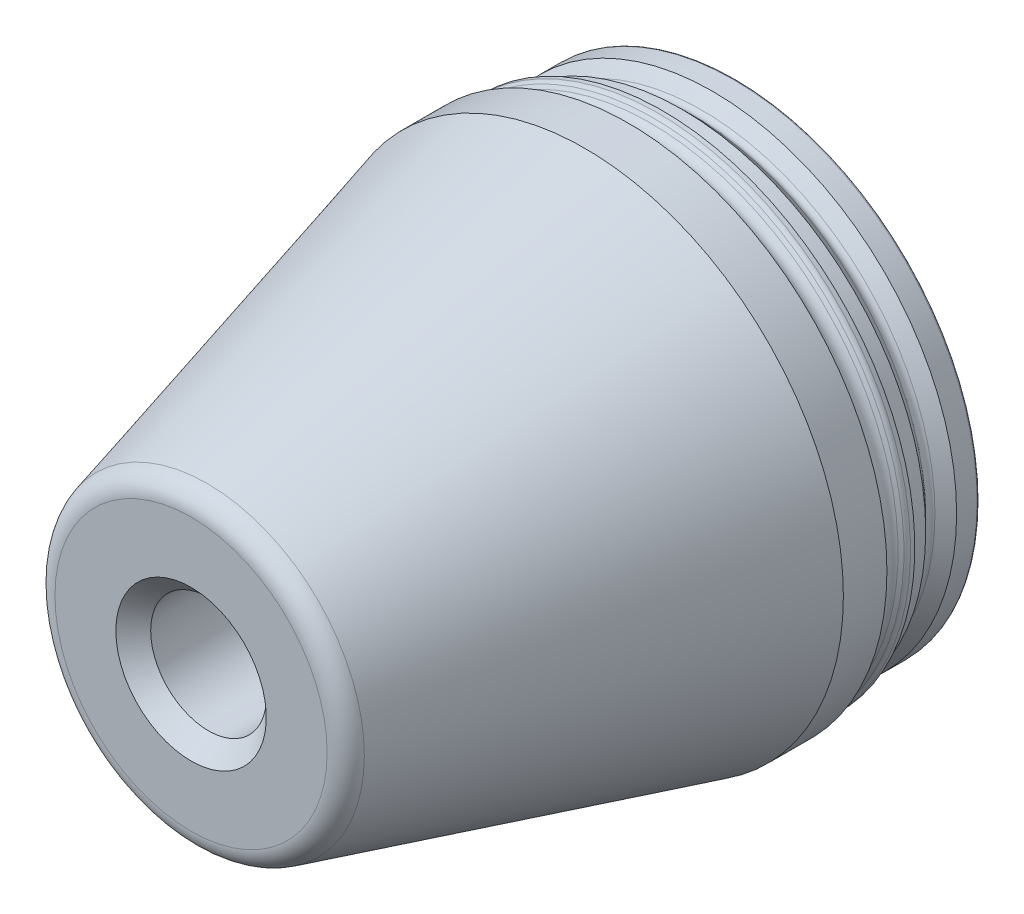
ISO-10303-21;
HEADER;
FILE_DESCRIPTION(('STEP AP214'),'2;1');
FILE_NAME('part.step','',(''),(''),'','','');
FILE_SCHEMA(('AUTOMOTIVE_DESIGN { 1 0 10303 214 1 1 1 1 }'));
ENDSEC;
DATA;
#1=APPLICATION_CONTEXT('core data for automotive mechanical design processes');
#2=APPLICATION_PROTOCOL_DEFINITION('international standard','automotive_design',2000,#1);
#3=PRODUCT_CONTEXT('',#1,'mechanical');
#4=PRODUCT('Part','Part','',(#3));
#5=PRODUCT_RELATED_PRODUCT_CATEGORY('part','',(#4));
#6=PRODUCT_DEFINITION_FORMATION('','',#4);
#7=PRODUCT_DEFINITION_CONTEXT('part definition',#1,'design');
#8=PRODUCT_DEFINITION('design','',#6,#7);
#9=PRODUCT_DEFINITION_SHAPE('','',#8);
#10=(LENGTH_UNIT() NAMED_UNIT(*) SI_UNIT(.MILLI.,.METRE.));
#11=(NAMED_UNIT(*) PLANE_ANGLE_UNIT() SI_UNIT($,.RADIAN.));
#12=(NAMED_UNIT(*) SI_UNIT($,.STERADIAN.) SOLID_ANGLE_UNIT());
#13=UNCERTAINTY_MEASURE_WITH_UNIT(LENGTH_MEASURE(1.E-05),#10,'distance_accuracy_value','');
#14=(GEOMETRIC_REPRESENTATION_CONTEXT(3) GLOBAL_UNCERTAINTY_ASSIGNED_CONTEXT((#13)) GLOBAL_UNIT_ASSIGNED_CONTEXT((#10,
#11,#12)) REPRESENTATION_CONTEXT('',''));
#15=CARTESIAN_POINT('',(0.,0.,0.));
#16=DIRECTION('',(0.,0.,1.));
#17=DIRECTION('',(1.,0.,0.));
#18=AXIS2_PLACEMENT_3D('',#15,#16,#17);
#19=CARTESIAN_POINT('',(0.,0.,47.5723097288361));
#20=DIRECTION('',(0.,0.,-1.));
#21=DIRECTION('',(-1.,0.,0.));
#22=AXIS2_PLACEMENT_3D('',#19,#20,#21);
#23=CYLINDRICAL_SURFACE('',#22,30.1625);
#24=CARTESIAN_POINT('',(0.,0.,9.0577621749045));
#25=DIRECTION('',(0.,0.,-1.));
#26=DIRECTION('',(-1.,0.,0.));
#27=AXIS2_PLACEMENT_3D('',#24,#25,#26);
#28=CIRCLE('',#27,30.1625);
#29=CARTESIAN_POINT('',(-30.1625,0.,9.0577621749045));
#30=VERTEX_POINT('',#29);
#31=EDGE_CURVE('E10',#30,#30,#28,.T.);
#32=ORIENTED_EDGE('',*,*,#31,.T.);
#33=EDGE_LOOP('',(#32));
#34=FACE_BOUND('',#33,.T.);
#35=CARTESIAN_POINT('',(0.,0.,3.9777621749045));
#36=DIRECTION('',(0.,0.,-1.));
#37=DIRECTION('',(-1.,0.,0.));
#38=AXIS2_PLACEMENT_3D('',#35,#36,#37);
#39=CIRCLE('',#38,30.1625);
#40=CARTESIAN_POINT('',(-30.1625,0.,3.9777621749045));
#41=VERTEX_POINT('',#40);
#42=EDGE_CURVE('E108',#41,#41,#39,.T.);
#43=ORIENTED_EDGE('',*,*,#42,.F.);
#44=EDGE_LOOP('',(#43));
#45=FACE_BOUND('',#44,.T.);
#46=ADVANCED_FACE('F38',(#34,#45),#23,.T.);
#47=CARTESIAN_POINT('',(0.,0.,9.0577621749045));
#48=DIRECTION('',(0.,0.,-1.));
#49=DIRECTION('',(-1.,0.,0.));
#50=AXIS2_PLACEMENT_3D('',#47,#48,#49);
#51=CONICAL_SURFACE('',#50,30.1625,0.262449830260544);
#52=CARTESIAN_POINT('',(0.,0.,53.1099960644797));
#53=DIRECTION('',(0.,0.,-1.));
#54=DIRECTION('',(-1.,0.,0.));
#55=AXIS2_PLACEMENT_3D('',#52,#53,#54);
#56=CIRCLE('',#55,18.3280234786891);
#57=CARTESIAN_POINT('',(-18.3280234786891,0.,53.1099960644797));
#58=VERTEX_POINT('',#57);
#59=EDGE_CURVE('E44',#58,#58,#56,.T.);
#60=ORIENTED_EDGE('',*,*,#59,.T.);
#61=EDGE_LOOP('',(#60));
#62=FACE_BOUND('',#61,.T.);
#63=ORIENTED_EDGE('',*,*,#31,.F.);
#64=EDGE_LOOP('',(#63));
#65=FACE_BOUND('',#64,.T.);
#66=ADVANCED_FACE('F116',(#62,#65),#51,.T.);
#67=CARTESIAN_POINT('',(0.,0.,52.451));
#68=DIRECTION('',(0.,0.,-1.));
#69=DIRECTION('',(-1.,0.,0.));
#70=AXIS2_PLACEMENT_3D('',#67,#68,#69);
#71=TOROIDAL_SURFACE('',#70,15.875,2.53999999999999);
#72=CARTESIAN_POINT('',(0.,0.,54.991));
#73=DIRECTION('',(0.,0.,-1.));
#74=DIRECTION('',(-1.,0.,0.));
#75=AXIS2_PLACEMENT_3D('',#72,#73,#74);
#76=CIRCLE('',#75,15.875);
#77=CARTESIAN_POINT('',(-15.875,0.,54.991));
#78=VERTEX_POINT('',#77);
#79=EDGE_CURVE('E48',#78,#78,#76,.T.);
#80=ORIENTED_EDGE('',*,*,#79,.T.);
#81=EDGE_LOOP('',(#80));
#82=FACE_BOUND('',#81,.T.);
#83=ORIENTED_EDGE('',*,*,#59,.F.);
#84=EDGE_LOOP('',(#83));
#85=FACE_BOUND('',#84,.T.);
#86=ADVANCED_FACE('F120',(#82,#85),#71,.T.);
#87=CARTESIAN_POINT('',(0.,15.875,54.991));
#88=DIRECTION('',(0.,0.,1.));
#89=DIRECTION('',(1.,0.,0.));
#90=AXIS2_PLACEMENT_3D('',#87,#88,#89);
#91=PLANE('',#90);
#92=CARTESIAN_POINT('',(0.,0.,54.991));
#93=DIRECTION('',(0.,0.,-1.));
#94=DIRECTION('',(-1.,0.,0.));
#95=AXIS2_PLACEMENT_3D('',#92,#93,#94);
#96=CIRCLE('',#95,8.77569999999999);
#97=CARTESIAN_POINT('',(-8.77569999999999,0.,54.991));
#98=VERTEX_POINT('',#97);
#99=EDGE_CURVE('E52',#98,#98,#96,.T.);
#100=ORIENTED_EDGE('',*,*,#99,.T.);
#101=EDGE_LOOP('',(#100));
#102=FACE_BOUND('',#101,.T.);
#103=ORIENTED_EDGE('',*,*,#79,.F.);
#104=EDGE_LOOP('',(#103));
#105=FACE_BOUND('',#104,.T.);
#106=ADVANCED_FACE('F124',(#102,#105),#91,.T.);
#107=CARTESIAN_POINT('',(0.,0.,54.991));
#108=DIRECTION('',(0.,0.,1.));
#109=DIRECTION('',(1.,0.,0.));
#110=AXIS2_PLACEMENT_3D('',#107,#108,#109);
#111=CONICAL_SURFACE('',#110,8.77569999999999,0.785398163397447);
#112=CARTESIAN_POINT('',(0.,0.,52.959));
#113=DIRECTION('',(0.,0.,-1.));
#114=DIRECTION('',(-1.,0.,0.));
#115=AXIS2_PLACEMENT_3D('',#112,#113,#114);
#116=CIRCLE('',#115,6.74369999999999);
#117=CARTESIAN_POINT('',(-6.74369999999999,0.,52.959));
#118=VERTEX_POINT('',#117);
#119=EDGE_CURVE('E57',#118,#118,#116,.T.);
#120=ORIENTED_EDGE('',*,*,#119,.T.);
#121=EDGE_LOOP('',(#120));
#122=FACE_BOUND('',#121,.T.);
#123=ORIENTED_EDGE('',*,*,#99,.F.);
#124=EDGE_LOOP('',(#123));
#125=FACE_BOUND('',#124,.T.);
#126=ADVANCED_FACE('F131',(#122,#125),#111,.F.);
#127=CARTESIAN_POINT('',(0.,0.,47.5723097288361));
#128=DIRECTION('',(0.,0.,-1.));
#129=DIRECTION('',(-1.,0.,0.));
#130=AXIS2_PLACEMENT_3D('',#127,#128,#129);
#131=CYLINDRICAL_SURFACE('',#130,6.7437);
#132=CARTESIAN_POINT('',(0.,0.,11.9395711757683));
#133=DIRECTION('',(0.,0.,-1.));
#134=DIRECTION('',(-1.,0.,0.));
#135=AXIS2_PLACEMENT_3D('',#132,#133,#134);
#136=CIRCLE('',#135,6.7437);
#137=CARTESIAN_POINT('',(-6.7437,0.,11.9395711757683));
#138=VERTEX_POINT('',#137);
#139=EDGE_CURVE('E60',#138,#138,#136,.T.);
#140=ORIENTED_EDGE('',*,*,#139,.T.);
#141=EDGE_LOOP('',(#140));
#142=FACE_BOUND('',#141,.T.);
#143=ORIENTED_EDGE('',*,*,#119,.F.);
#144=EDGE_LOOP('',(#143));
#145=FACE_BOUND('',#144,.T.);
#146=ADVANCED_FACE('F135',(#142,#145),#131,.F.);
#147=CARTESIAN_POINT('',(0.,0.,11.9395711757683));
#148=DIRECTION('',(0.,0.,-1.));
#149=DIRECTION('',(-1.,0.,0.));
#150=AXIS2_PLACEMENT_3D('',#147,#148,#149);
#151=CONICAL_SURFACE('',#150,6.7437,1.30899693899575);
#152=CARTESIAN_POINT('',(0.,0.,7.366));
#153=DIRECTION('',(0.,0.,-1.));
#154=DIRECTION('',(-1.,0.,0.));
#155=AXIS2_PLACEMENT_3D('',#152,#153,#154);
#156=CIRCLE('',#155,23.8125);
#157=CARTESIAN_POINT('',(-23.8125,0.,7.366));
#158=VERTEX_POINT('',#157);
#159=EDGE_CURVE('E63',#158,#158,#156,.T.);
#160=CARTESIAN_POINT('',(-23.8125,0.,7.366));
#161=CARTESIAN_POINT('',(-23.6347,0.,7.41364136641426));
#162=CARTESIAN_POINT('',(-23.4569,0.,7.46128273282851));
#163=CARTESIAN_POINT('',(-23.1013,0.,7.55656546565702));
#164=CARTESIAN_POINT('',(-22.9235,0.,7.60420683207127));
#165=CARTESIAN_POINT('',(-22.5679,0.,7.69948956489978));
#166=CARTESIAN_POINT('',(-22.3901,0.,7.74713093131403));
#167=CARTESIAN_POINT('',(-22.0345,0.,7.84241366414253));
#168=CARTESIAN_POINT('',(-21.8567,0.,7.89005503055679));
#169=CARTESIAN_POINT('',(-21.5011,0.,7.98533776338529));
#170=CARTESIAN_POINT('',(-21.3233,0.,8.03297912979955));
#171=CARTESIAN_POINT('',(-20.9677,0.,8.12826186262805));
#172=CARTESIAN_POINT('',(-20.7899,0.,8.17590322904231));
#173=CARTESIAN_POINT('',(-20.4343,0.,8.27118596187081));
#174=CARTESIAN_POINT('',(-20.2565,0.,8.31882732828506));
#175=CARTESIAN_POINT('',(-19.9009,0.,8.41411006111357));
#176=CARTESIAN_POINT('',(-19.7231,0.,8.46175142752782));
#177=CARTESIAN_POINT('',(-19.3675,0.,8.55703416035633));
#178=CARTESIAN_POINT('',(-19.1897,0.,8.60467552677058));
#179=CARTESIAN_POINT('',(-18.8341,0.,8.69995825959909));
#180=CARTESIAN_POINT('',(-18.6563,0.,8.74759962601334));
#181=CARTESIAN_POINT('',(-18.3007,0.,8.84288235884184));
#182=CARTESIAN_POINT('',(-18.1229,0.,8.8905237252561));
#183=CARTESIAN_POINT('',(-17.7673,0.,8.9858064580846));
#184=CARTESIAN_POINT('',(-17.5895,0.,9.03344782449886));
#185=CARTESIAN_POINT('',(-17.2339,0.,9.12873055732736));
#186=CARTESIAN_POINT('',(-17.0561,0.,9.17637192374162));
#187=CARTESIAN_POINT('',(-16.7005,0.,9.27165465657012));
#188=CARTESIAN_POINT('',(-16.5227,0.,9.31929602298437));
#189=CARTESIAN_POINT('',(-16.1671,0.,9.41457875581288));
#190=CARTESIAN_POINT('',(-15.9893,0.,9.46222012222713));
#191=CARTESIAN_POINT('',(-15.6337,0.,9.55750285505564));
#192=CARTESIAN_POINT('',(-15.4559,0.,9.60514422146989));
#193=CARTESIAN_POINT('',(-15.1003,0.,9.7004269542984));
#194=CARTESIAN_POINT('',(-14.9225,0.,9.74806832071265));
#195=CARTESIAN_POINT('',(-14.5669,0.,9.84335105354116));
#196=CARTESIAN_POINT('',(-14.3891,0.,9.89099241995541));
#197=CARTESIAN_POINT('',(-14.0335,0.,9.98627515278391));
#198=CARTESIAN_POINT('',(-13.8557,0.,10.0339165191982));
#199=CARTESIAN_POINT('',(-13.5001,0.,10.1291992520267));
#200=CARTESIAN_POINT('',(-13.3223,0.,10.1768406184409));
#201=CARTESIAN_POINT('',(-12.9667,0.,10.2721233512694));
#202=CARTESIAN_POINT('',(-12.7889,0.,10.3197647176837));
#203=CARTESIAN_POINT('',(-12.4333,0.,10.4150474505122));
#204=CARTESIAN_POINT('',(-12.2555,0.,10.4626888169264));
#205=CARTESIAN_POINT('',(-11.8999,0.,10.557971549755));
#206=CARTESIAN_POINT('',(-11.7221,0.,10.6056129161692));
#207=CARTESIAN_POINT('',(-11.3665,0.,10.7008956489977));
#208=CARTESIAN_POINT('',(-11.1887,0.,10.748537015412));
#209=CARTESIAN_POINT('',(-10.8331,0.,10.8438197482405));
#210=CARTESIAN_POINT('',(-10.6553,0.,10.8914611146547));
#211=CARTESIAN_POINT('',(-10.2997,0.,10.9867438474832));
#212=CARTESIAN_POINT('',(-10.1219,0.,11.0343852138975));
#213=CARTESIAN_POINT('',(-9.76629999999999,0.,11.129667946726));
#214=CARTESIAN_POINT('',(-9.58849999999999,0.,11.1773093131402));
#215=CARTESIAN_POINT('',(-9.23289999999999,0.,11.2725920459687));
#216=CARTESIAN_POINT('',(-9.05509999999999,0.,11.320233412383));
#217=CARTESIAN_POINT('',(-8.69949999999999,0.,11.4155161452115));
#218=CARTESIAN_POINT('',(-8.5217,0.,11.4631575116258));
#219=CARTESIAN_POINT('',(-8.16609999999999,0.,11.5584402444543));
#220=CARTESIAN_POINT('',(-7.9883,0.,11.6060816108685));
#221=CARTESIAN_POINT('',(-7.6327,0.,11.701364343697));
#222=CARTESIAN_POINT('',(-7.4549,0.,11.7490057101113));
#223=CARTESIAN_POINT('',(-7.0993,0.,11.8442884429398));
#224=CARTESIAN_POINT('',(-6.9215,0.,11.891929809354));
#225=CARTESIAN_POINT('',(-6.7437,0.,11.9395711757683));
#226=B_SPLINE_CURVE_WITH_KNOTS('',3,(#160,#161,#162,#163,#164,#165,#166,#167,#168,#169,#170,
#171,#172,#173,#174,#175,#176,#177,#178,#179,#180,#181,#182,#183,#184,#185,#186,#187,#188,#189,
#190,#191,#192,#193,#194,#195,#196,#197,#198,#199,#200,#201,#202,#203,#204,#205,#206,#207,#208,
#209,#210,#211,#212,#213,#214,#215,#216,#217,#218,#219,#220,#221,#222,#223,#224,#225),
.UNSPECIFIED.,.F.,.F.,(4,2,2,2,2,2,2,2,2,2,2,2,2,2,2,2,2,2,2,2,2,2,2,2,2,2,2,2,2,2,2,2,4),(0.,
0.552216314630741,1.10443262926148,1.65664894389221,2.20886525852295,2.76108157315369,
3.31329788778443,3.86551420241516,4.4177305170459,4.96994683167664,5.52216314630737,
6.07437946093811,6.62659577556885,7.17881209019959,7.73102840483032,8.28324471946106,
8.83546103409179,9.38767734872253,9.93989366335327,10.492109977984,11.0443262926147,
11.5965426072455,12.1487589218762,12.700975236507,13.2531915511377,13.8054078657684,
14.3576241803992,14.9098404950299,15.4620568096606,16.0142731242914,16.5664894389221,
17.1187057535529,17.6709220681836),.UNSPECIFIED.);
#227=EDGE_CURVE('BSEAM139',#158,#138,#226,.T.);
#228=ORIENTED_EDGE('',*,*,#159,.T.);
#229=ORIENTED_EDGE('',*,*,#139,.F.);
#230=ORIENTED_EDGE('',*,*,#227,.T.);
#231=ORIENTED_EDGE('',*,*,#227,.F.);
#232=EDGE_LOOP('',(#228,#230,#229,#231));
#233=FACE_BOUND('',#232,.T.);
#234=ADVANCED_FACE('F139',(#233),#151,.F.);
#235=CARTESIAN_POINT('',(0.,0.,47.5723097288361));
#236=DIRECTION('',(0.,0.,-1.));
#237=DIRECTION('',(-1.,0.,0.));
#238=AXIS2_PLACEMENT_3D('',#235,#236,#237);
#239=CYLINDRICAL_SURFACE('',#238,23.8125);
#240=CARTESIAN_POINT('',(0.,0.,-8.128));
#241=DIRECTION('',(0.,0.,-1.));
#242=DIRECTION('',(-1.,0.,0.));
#243=AXIS2_PLACEMENT_3D('',#240,#241,#242);
#244=CIRCLE('',#243,23.8125);
#245=CARTESIAN_POINT('',(-23.8125,0.,-8.128));
#246=VERTEX_POINT('',#245);
#247=EDGE_CURVE('E66',#246,#246,#244,.T.);
#248=ORIENTED_EDGE('',*,*,#247,.T.);
#249=EDGE_LOOP('',(#248));
#250=FACE_BOUND('',#249,.T.);
#251=ORIENTED_EDGE('',*,*,#159,.F.);
#252=EDGE_LOOP('',(#251));
#253=FACE_BOUND('',#252,.T.);
#254=ADVANCED_FACE('F143',(#250,#253),#239,.F.);
#255=CARTESIAN_POINT('',(0.,0.,-8.128));
#256=DIRECTION('',(0.,0.,-1.));
#257=DIRECTION('',(-1.,0.,0.));
#258=AXIS2_PLACEMENT_3D('',#255,#256,#257);
#259=CONICAL_SURFACE('',#258,23.8125,0.785398163397453);
#260=CARTESIAN_POINT('',(0.,0.,-8.509));
#261=DIRECTION('',(0.,0.,-1.));
#262=DIRECTION('',(-1.,0.,0.));
#263=AXIS2_PLACEMENT_3D('',#260,#261,#262);
#264=CIRCLE('',#263,24.1935);
#265=CARTESIAN_POINT('',(-24.1935,0.,-8.509));
#266=VERTEX_POINT('',#265);
#267=EDGE_CURVE('E69',#266,#266,#264,.T.);
#268=ORIENTED_EDGE('',*,*,#267,.T.);
#269=EDGE_LOOP('',(#268));
#270=FACE_BOUND('',#269,.T.);
#271=ORIENTED_EDGE('',*,*,#247,.F.);
#272=EDGE_LOOP('',(#271));
#273=FACE_BOUND('',#272,.T.);
#274=ADVANCED_FACE('F147',(#270,#273),#259,.F.);
#275=CARTESIAN_POINT('',(0.,28.194,-8.50899999999999));
#276=DIRECTION('',(0.,0.,-1.));
#277=DIRECTION('',(-1.,0.,0.));
#278=AXIS2_PLACEMENT_3D('',#275,#276,#277);
#279=PLANE('',#278);
#280=CARTESIAN_POINT('',(0.,0.,-8.50899999999998));
#281=DIRECTION('',(0.,0.,-1.));
#282=DIRECTION('',(-1.,0.,0.));
#283=AXIS2_PLACEMENT_3D('',#280,#281,#282);
#284=CIRCLE('',#283,28.194);
#285=CARTESIAN_POINT('',(-28.194,0.,-8.50899999999998));
#286=VERTEX_POINT('',#285);
#287=EDGE_CURVE('E72',#286,#286,#284,.T.);
#288=ORIENTED_EDGE('',*,*,#287,.T.);
#289=EDGE_LOOP('',(#288));
#290=FACE_BOUND('',#289,.T.);
#291=ORIENTED_EDGE('',*,*,#267,.F.);
#292=EDGE_LOOP('',(#291));
#293=FACE_BOUND('',#292,.T.);
#294=ADVANCED_FACE('F151',(#290,#293),#279,.T.);
#295=CARTESIAN_POINT('',(0.,0.,-8.25499999999998));
#296=DIRECTION('',(0.,0.,-1.));
#297=DIRECTION('',(-1.,0.,0.));
#298=AXIS2_PLACEMENT_3D('',#295,#296,#297);
#299=TOROIDAL_SURFACE('',#298,28.194,0.254);
#300=CARTESIAN_POINT('',(0.,0.,-8.25499999999998));
#301=DIRECTION('',(0.,0.,-1.));
#302=DIRECTION('',(-1.,0.,0.));
#303=AXIS2_PLACEMENT_3D('',#300,#301,#302);
#304=CIRCLE('',#303,28.448);
#305=CARTESIAN_POINT('',(-28.448,0.,-8.25499999999998));
#306=VERTEX_POINT('',#305);
#307=EDGE_CURVE('E75',#306,#306,#304,.T.);
#308=ORIENTED_EDGE('',*,*,#307,.T.);
#309=EDGE_LOOP('',(#308));
#310=FACE_BOUND('',#309,.T.);
#311=ORIENTED_EDGE('',*,*,#287,.F.);
#312=EDGE_LOOP('',(#311));
#313=FACE_BOUND('',#312,.T.);
#314=ADVANCED_FACE('F155',(#310,#313),#299,.T.);
#315=CARTESIAN_POINT('',(0.,0.,47.5723097288361));
#316=DIRECTION('',(0.,0.,-1.));
#317=DIRECTION('',(-1.,0.,0.));
#318=AXIS2_PLACEMENT_3D('',#315,#316,#317);
#319=CYLINDRICAL_SURFACE('',#318,28.448);
#320=CARTESIAN_POINT('',(0.,0.,-5.86739997471569));
#321=DIRECTION('',(0.,0.,-1.));
#322=DIRECTION('',(-1.,0.,0.));
#323=AXIS2_PLACEMENT_3D('',#320,#321,#322);
#324=CIRCLE('',#323,28.448);
#325=CARTESIAN_POINT('',(-28.448,0.,-5.86739997471569));
#326=VERTEX_POINT('',#325);
#327=EDGE_CURVE('E78',#326,#326,#324,.T.);
#328=ORIENTED_EDGE('',*,*,#327,.T.);
#329=EDGE_LOOP('',(#328));
#330=FACE_BOUND('',#329,.T.);
#331=ORIENTED_EDGE('',*,*,#307,.F.);
#332=EDGE_LOOP('',(#331));
#333=FACE_BOUND('',#332,.T.);
#334=ADVANCED_FACE('F159',(#330,#333),#319,.T.);
#335=CARTESIAN_POINT('',(0.,0.,-5.86739997471569));
#336=DIRECTION('',(0.,0.,-1.));
#337=DIRECTION('',(-1.,0.,0.));
#338=AXIS2_PLACEMENT_3D('',#335,#336,#337);
#339=CONICAL_SURFACE('',#338,28.448,0.785398163397435);
#340=CARTESIAN_POINT('',(0.,0.,-4.60281536726409));
#341=DIRECTION('',(0.,0.,-1.));
#342=DIRECTION('',(-1.,0.,0.));
#343=AXIS2_PLACEMENT_3D('',#340,#341,#342);
#344=CIRCLE('',#343,27.1834153925484);
#345=CARTESIAN_POINT('',(-27.1834153925484,0.,-4.60281536726409));
#346=VERTEX_POINT('',#345);
#347=EDGE_CURVE('E81',#346,#346,#344,.T.);
#348=ORIENTED_EDGE('',*,*,#347,.T.);
#349=EDGE_LOOP('',(#348));
#350=FACE_BOUND('',#349,.T.);
#351=ORIENTED_EDGE('',*,*,#327,.F.);
#352=EDGE_LOOP('',(#351));
#353=FACE_BOUND('',#352,.T.);
#354=ADVANCED_FACE('F163',(#350,#353),#339,.T.);
#355=CARTESIAN_POINT('',(0.,0.,-4.06399999999994));
#356=DIRECTION('',(0.,0.,-1.));
#357=DIRECTION('',(-1.,0.,0.));
#358=AXIS2_PLACEMENT_3D('',#355,#356,#357);
#359=TOROIDAL_SURFACE('',#358,27.7222307598126,0.762000000000001);
#360=CARTESIAN_POINT('',(0.,0.,-3.52518463273579));
#361=DIRECTION('',(0.,0.,-1.));
#362=DIRECTION('',(-1.,0.,0.));
#363=AXIS2_PLACEMENT_3D('',#360,#361,#362);
#364=CIRCLE('',#363,27.1834153925484);
#365=CARTESIAN_POINT('',(-27.1834153925484,0.,-3.52518463273579));
#366=VERTEX_POINT('',#365);
#367=EDGE_CURVE('E84',#366,#366,#364,.T.);
#368=ORIENTED_EDGE('',*,*,#367,.T.);
#369=EDGE_LOOP('',(#368));
#370=FACE_BOUND('',#369,.T.);
#371=ORIENTED_EDGE('',*,*,#347,.F.);
#372=EDGE_LOOP('',(#371));
#373=FACE_BOUND('',#372,.T.);
#374=ADVANCED_FACE('F167',(#370,#373),#359,.F.);
#375=CARTESIAN_POINT('',(0.,0.,-3.52518463273579));
#376=DIRECTION('',(0.,0.,1.));
#377=DIRECTION('',(1.,0.,0.));
#378=AXIS2_PLACEMENT_3D('',#375,#376,#377);
#379=CONICAL_SURFACE('',#378,27.1834153925484,0.785398163397463);
#380=CARTESIAN_POINT('',(0.,0.,-2.26060002528426));
#381=DIRECTION('',(0.,0.,-1.));
#382=DIRECTION('',(-1.,0.,0.));
#383=AXIS2_PLACEMENT_3D('',#380,#381,#382);
#384=CIRCLE('',#383,28.448);
#385=CARTESIAN_POINT('',(-28.448,0.,-2.26060002528426));
#386=VERTEX_POINT('',#385);
#387=EDGE_CURVE('E87',#386,#386,#384,.T.);
#388=ORIENTED_EDGE('',*,*,#387,.T.);
#389=EDGE_LOOP('',(#388));
#390=FACE_BOUND('',#389,.T.);
#391=ORIENTED_EDGE('',*,*,#367,.F.);
#392=EDGE_LOOP('',(#391));
#393=FACE_BOUND('',#392,.T.);
#394=ADVANCED_FACE('F171',(#390,#393),#379,.T.);
#395=CARTESIAN_POINT('',(0.,0.,47.5723097288361));
#396=DIRECTION('',(0.,0.,-1.));
#397=DIRECTION('',(-1.,0.,0.));
#398=AXIS2_PLACEMENT_3D('',#395,#396,#397);
#399=CYLINDRICAL_SURFACE('',#398,28.448);
#400=CARTESIAN_POINT('',(0.,0.,0.));
#401=DIRECTION('',(0.,0.,-1.));
#402=DIRECTION('',(-1.,0.,0.));
#403=AXIS2_PLACEMENT_3D('',#400,#401,#402);
#404=CIRCLE('',#403,28.448);
#405=CARTESIAN_POINT('',(-28.448,0.,0.));
#406=VERTEX_POINT('',#405);
#407=EDGE_CURVE('E90',#406,#406,#404,.T.);
#408=ORIENTED_EDGE('',*,*,#407,.T.);
#409=EDGE_LOOP('',(#408));
#410=FACE_BOUND('',#409,.T.);
#411=ORIENTED_EDGE('',*,*,#387,.F.);
#412=EDGE_LOOP('',(#411));
#413=FACE_BOUND('',#412,.T.);
#414=ADVANCED_FACE('F175',(#410,#413),#399,.T.);
#415=CARTESIAN_POINT('',(0.,29.4386,0.));
#416=DIRECTION('',(0.,0.,-1.));
#417=DIRECTION('',(-1.,0.,0.));
#418=AXIS2_PLACEMENT_3D('',#415,#416,#417);
#419=PLANE('',#418);
#420=CARTESIAN_POINT('',(0.,0.,0.));
#421=DIRECTION('',(0.,0.,-1.));
#422=DIRECTION('',(-1.,0.,0.));
#423=AXIS2_PLACEMENT_3D('',#420,#421,#422);
#424=CIRCLE('',#423,29.4386);
#425=CARTESIAN_POINT('',(-29.4386,0.,0.));
#426=VERTEX_POINT('',#425);
#427=EDGE_CURVE('E93',#426,#426,#424,.T.);
#428=ORIENTED_EDGE('',*,*,#427,.T.);
#429=EDGE_LOOP('',(#428));
#430=FACE_BOUND('',#429,.T.);
#431=ORIENTED_EDGE('',*,*,#407,.F.);
#432=EDGE_LOOP('',(#431));
#433=FACE_BOUND('',#432,.T.);
#434=ADVANCED_FACE('F179',(#430,#433),#419,.T.);
#435=CARTESIAN_POINT('',(0.,0.,47.5723097288361));
#436=DIRECTION('',(0.,0.,-1.));
#437=DIRECTION('',(-1.,0.,0.));
#438=AXIS2_PLACEMENT_3D('',#435,#436,#437);
#439=CYLINDRICAL_SURFACE('',#438,29.4386);
#440=CARTESIAN_POINT('',(0.,0.,0.508000000000008));
#441=DIRECTION('',(0.,0.,-1.));
#442=DIRECTION('',(-1.,0.,0.));
#443=AXIS2_PLACEMENT_3D('',#440,#441,#442);
#444=CIRCLE('',#443,29.4386);
#445=CARTESIAN_POINT('',(-29.4386,0.,0.508000000000008));
#446=VERTEX_POINT('',#445);
#447=EDGE_CURVE('E96',#446,#446,#444,.T.);
#448=ORIENTED_EDGE('',*,*,#447,.T.);
#449=EDGE_LOOP('',(#448));
#450=FACE_BOUND('',#449,.T.);
#451=ORIENTED_EDGE('',*,*,#427,.F.);
#452=EDGE_LOOP('',(#451));
#453=FACE_BOUND('',#452,.T.);
#454=ADVANCED_FACE('F183',(#450,#453),#439,.T.);
#455=CARTESIAN_POINT('',(0.,0.,0.508000000000008));
#456=DIRECTION('',(0.,0.,-1.));
#457=DIRECTION('',(-1.,0.,0.));
#458=AXIS2_PLACEMENT_3D('',#455,#456,#457);
#459=TOROIDAL_SURFACE('',#458,28.6766,0.762000000000002);
#460=CARTESIAN_POINT('',(0.,0.,1.04681536726414));
#461=DIRECTION('',(0.,0.,-1.));
#462=DIRECTION('',(-1.,0.,0.));
#463=AXIS2_PLACEMENT_3D('',#460,#461,#462);
#464=CIRCLE('',#463,29.2154153672642);
#465=CARTESIAN_POINT('',(-29.2154153672642,0.,1.04681536726414));
#466=VERTEX_POINT('',#465);
#467=EDGE_CURVE('E99',#466,#466,#464,.T.);
#468=ORIENTED_EDGE('',*,*,#467,.T.);
#469=EDGE_LOOP('',(#468));
#470=FACE_BOUND('',#469,.T.);
#471=ORIENTED_EDGE('',*,*,#447,.F.);
#472=EDGE_LOOP('',(#471));
#473=FACE_BOUND('',#472,.T.);
#474=ADVANCED_FACE('F187',(#470,#473),#459,.T.);
#475=CARTESIAN_POINT('',(0.,0.,1.04681536726414));
#476=DIRECTION('',(0.,0.,-1.));
#477=DIRECTION('',(-1.,0.,0.));
#478=AXIS2_PLACEMENT_3D('',#475,#476,#477);
#479=CONICAL_SURFACE('',#478,29.2154153672642,0.785398163397413);
#480=CARTESIAN_POINT('',(0.,0.,1.38797438789311));
#481=DIRECTION('',(0.,0.,-1.));
#482=DIRECTION('',(-1.,0.,0.));
#483=AXIS2_PLACEMENT_3D('',#480,#481,#482);
#484=CIRCLE('',#483,28.8742563466352);
#485=CARTESIAN_POINT('',(-28.8742563466352,0.,1.38797438789311));
#486=VERTEX_POINT('',#485);
#487=EDGE_CURVE('E102',#486,#486,#484,.T.);
#488=ORIENTED_EDGE('',*,*,#487,.T.);
#489=EDGE_LOOP('',(#488));
#490=FACE_BOUND('',#489,.T.);
#491=ORIENTED_EDGE('',*,*,#467,.F.);
#492=EDGE_LOOP('',(#491));
#493=FACE_BOUND('',#492,.T.);
#494=ADVANCED_FACE('F191',(#490,#493),#479,.T.);
#495=CARTESIAN_POINT('',(0.,0.,2.286));
#496=DIRECTION('',(0.,0.,-1.));
#497=DIRECTION('',(-1.,0.,0.));
#498=AXIS2_PLACEMENT_3D('',#495,#496,#497);
#499=TOROIDAL_SURFACE('',#498,29.7722819587422,1.27);
#500=CARTESIAN_POINT('',(0.,0.,3.38585226280623));
#501=DIRECTION('',(0.,0.,-1.));
#502=DIRECTION('',(-1.,0.,0.));
#503=AXIS2_PLACEMENT_3D('',#500,#501,#502);
#504=CIRCLE('',#503,29.1372819587422);
#505=CARTESIAN_POINT('',(-29.1372819587422,0.,3.38585226280623));
#506=VERTEX_POINT('',#505);
#507=EDGE_CURVE('E105',#506,#506,#504,.T.);
#508=ORIENTED_EDGE('',*,*,#507,.T.);
#509=EDGE_LOOP('',(#508));
#510=FACE_BOUND('',#509,.T.);
#511=ORIENTED_EDGE('',*,*,#487,.F.);
#512=EDGE_LOOP('',(#511));
#513=FACE_BOUND('',#512,.T.);
#514=ADVANCED_FACE('F195',(#510,#513),#499,.F.);
#515=CARTESIAN_POINT('',(0.,0.,3.38585226280623));
#516=DIRECTION('',(0.,0.,1.));
#517=DIRECTION('',(1.,0.,0.));
#518=AXIS2_PLACEMENT_3D('',#515,#516,#517);
#519=CONICAL_SURFACE('',#518,29.1372819587422,1.0471975511966);
#520=ORIENTED_EDGE('',*,*,#42,.T.);
#521=EDGE_LOOP('',(#520));
#522=FACE_BOUND('',#521,.T.);
#523=ORIENTED_EDGE('',*,*,#507,.F.);
#524=EDGE_LOOP('',(#523));
#525=FACE_BOUND('',#524,.T.);
#526=ADVANCED_FACE('F112',(#522,#525),#519,.T.);
#527=CLOSED_SHELL('',(#46,#66,#86,#106,#126,#146,#234,#254,#274,#294,#314,#334,#354,#374,#394,
#414,#434,#454,#474,#494,#514,#526));
#528=MANIFOLD_SOLID_BREP('B2',#527);
#529=ADVANCED_BREP_SHAPE_REPRESENTATION('',(#18,#528),#14);
#530=SHAPE_DEFINITION_REPRESENTATION(#9,#529);
ENDSEC;
END-ISO-10303-21;
